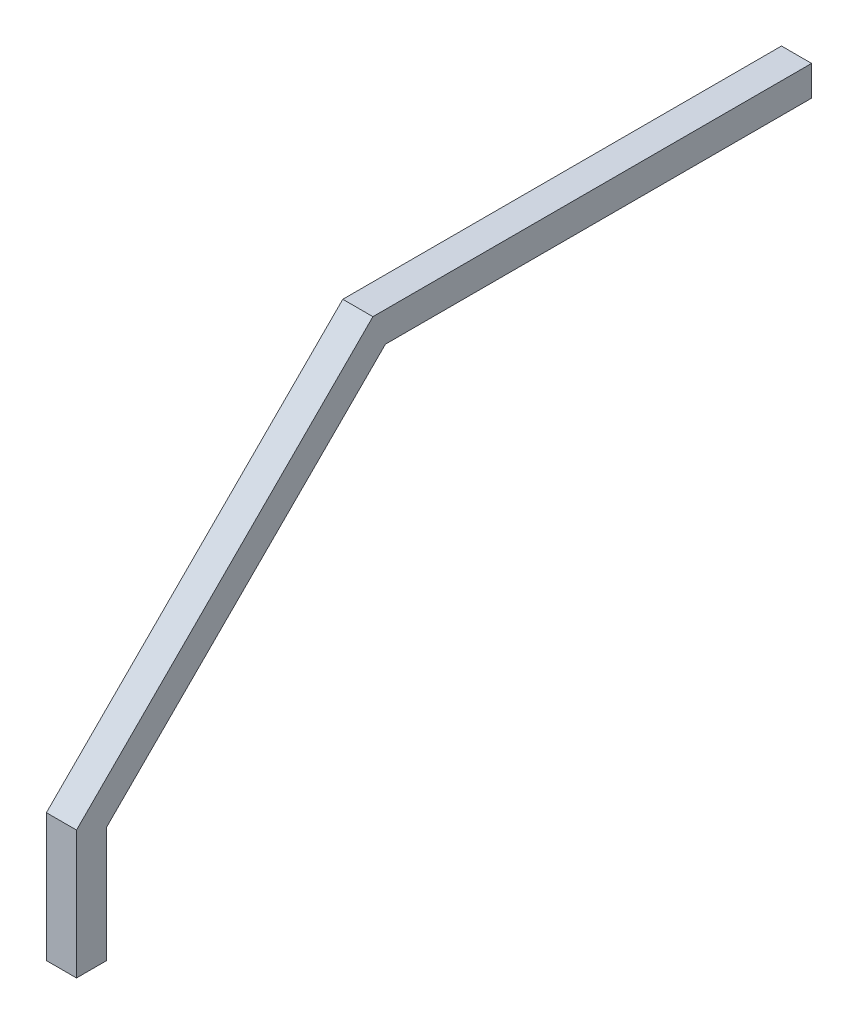
ISO-10303-21;
HEADER;
FILE_DESCRIPTION(('STEP AP214'),'2;1');
FILE_NAME('part.step','',(''),(''),'','','');
FILE_SCHEMA(('AUTOMOTIVE_DESIGN { 1 0 10303 214 1 1 1 1 }'));
ENDSEC;
DATA;
#1=APPLICATION_CONTEXT('core data for automotive mechanical design processes');
#2=APPLICATION_PROTOCOL_DEFINITION('international standard','automotive_design',2000,#1);
#3=PRODUCT_CONTEXT('',#1,'mechanical');
#4=PRODUCT('Part','Part','',(#3));
#5=PRODUCT_RELATED_PRODUCT_CATEGORY('part','',(#4));
#6=PRODUCT_DEFINITION_FORMATION('','',#4);
#7=PRODUCT_DEFINITION_CONTEXT('part definition',#1,'design');
#8=PRODUCT_DEFINITION('design','',#6,#7);
#9=PRODUCT_DEFINITION_SHAPE('','',#8);
#10=(LENGTH_UNIT() NAMED_UNIT(*) SI_UNIT(.MILLI.,.METRE.));
#11=(NAMED_UNIT(*) PLANE_ANGLE_UNIT() SI_UNIT($,.RADIAN.));
#12=(NAMED_UNIT(*) SI_UNIT($,.STERADIAN.) SOLID_ANGLE_UNIT());
#13=UNCERTAINTY_MEASURE_WITH_UNIT(LENGTH_MEASURE(1.E-05),#10,'distance_accuracy_value','');
#14=(GEOMETRIC_REPRESENTATION_CONTEXT(3) GLOBAL_UNCERTAINTY_ASSIGNED_CONTEXT((#13)) GLOBAL_UNIT_ASSIGNED_CONTEXT((#10,
#11,#12)) REPRESENTATION_CONTEXT('',''));
#15=CARTESIAN_POINT('',(0.,0.,0.));
#16=DIRECTION('',(0.,0.,1.));
#17=DIRECTION('',(1.,0.,0.));
#18=AXIS2_PLACEMENT_3D('',#15,#16,#17);
#19=CARTESIAN_POINT('',(25.4,450.,0.));
#20=DIRECTION('',(0.,0.,-1.));
#21=DIRECTION('',(-1.,0.,0.));
#22=AXIS2_PLACEMENT_3D('',#19,#20,#21);
#23=PLANE('',#22);
#24=DIRECTION('',(0.,-1.,0.));
#25=VECTOR('',#24,1.);
#26=CARTESIAN_POINT('',(0.,450.,0.));
#27=LINE('',#26,#25);
#28=CARTESIAN_POINT('',(0.,450.,0.));
#29=VERTEX_POINT('',#28);
#30=CARTESIAN_POINT('',(0.,341.93505652956,0.));
#31=VERTEX_POINT('',#30);
#32=EDGE_CURVE('E129',#29,#31,#27,.T.);
#33=ORIENTED_EDGE('',*,*,#32,.T.);
#34=DIRECTION('',(-1.,0.,0.));
#35=VECTOR('',#34,1.);
#36=CARTESIAN_POINT('',(25.4,341.93505652956,0.));
#37=LINE('',#36,#35);
#38=CARTESIAN_POINT('',(25.4,341.93505652956,0.));
#39=VERTEX_POINT('',#38);
#40=EDGE_CURVE('E11',#39,#31,#37,.T.);
#41=ORIENTED_EDGE('',*,*,#40,.F.);
#42=DIRECTION('',(0.,-1.,0.));
#43=VECTOR('',#42,1.);
#44=CARTESIAN_POINT('',(25.4,450.,0.));
#45=LINE('',#44,#43);
#46=CARTESIAN_POINT('',(25.4,450.,0.));
#47=VERTEX_POINT('',#46);
#48=EDGE_CURVE('E143',#47,#39,#45,.T.);
#49=ORIENTED_EDGE('',*,*,#48,.F.);
#50=DIRECTION('',(-1.,0.,0.));
#51=VECTOR('',#50,1.);
#52=CARTESIAN_POINT('',(25.4,450.,0.));
#53=LINE('',#52,#51);
#54=EDGE_CURVE('E125',#47,#29,#53,.T.);
#55=ORIENTED_EDGE('',*,*,#54,.T.);
#56=EDGE_LOOP('',(#33,#41,#49,#55));
#57=FACE_BOUND('',#56,.T.);
#58=ADVANCED_FACE('F33',(#57),#23,.F.);
#59=CARTESIAN_POINT('',(25.4,341.93505652956,0.));
#60=DIRECTION('',(0.,1.,0.));
#61=DIRECTION('',(0.,0.,1.));
#62=AXIS2_PLACEMENT_3D('',#59,#60,#61);
#63=PLANE('',#62);
#64=DIRECTION('',(0.,0.,-1.));
#65=VECTOR('',#64,1.);
#66=CARTESIAN_POINT('',(0.,341.93505652956,0.));
#67=LINE('',#66,#65);
#68=CARTESIAN_POINT('',(0.,341.93505652956,-25.4));
#69=VERTEX_POINT('',#68);
#70=EDGE_CURVE('E132',#31,#69,#67,.T.);
#71=ORIENTED_EDGE('',*,*,#70,.T.);
#72=DIRECTION('',(-1.,0.,0.));
#73=VECTOR('',#72,1.);
#74=CARTESIAN_POINT('',(25.4,341.93505652956,-25.4));
#75=LINE('',#74,#73);
#76=CARTESIAN_POINT('',(25.4,341.93505652956,-25.4));
#77=VERTEX_POINT('',#76);
#78=EDGE_CURVE('E41',#77,#69,#75,.T.);
#79=ORIENTED_EDGE('',*,*,#78,.F.);
#80=DIRECTION('',(0.,0.,-1.));
#81=VECTOR('',#80,1.);
#82=CARTESIAN_POINT('',(25.4,341.93505652956,0.));
#83=LINE('',#82,#81);
#84=EDGE_CURVE('E92',#39,#77,#83,.T.);
#85=ORIENTED_EDGE('',*,*,#84,.F.);
#86=ORIENTED_EDGE('',*,*,#40,.T.);
#87=EDGE_LOOP('',(#71,#79,#85,#86));
#88=FACE_BOUND('',#87,.T.);
#89=ADVANCED_FACE('F178',(#88),#63,.F.);
#90=CARTESIAN_POINT('',(25.4,439.478975515723,-25.4));
#91=DIRECTION('',(0.,0.,1.));
#92=DIRECTION('',(0.,-1.,0.));
#93=AXIS2_PLACEMENT_3D('',#90,#91,#92);
#94=PLANE('',#93);
#95=DIRECTION('',(0.,1.,0.));
#96=VECTOR('',#95,1.);
#97=CARTESIAN_POINT('',(0.,439.478975515723,-25.4));
#98=LINE('',#97,#96);
#99=CARTESIAN_POINT('',(0.,439.478975515723,-25.4));
#100=VERTEX_POINT('',#99);
#101=EDGE_CURVE('E134',#69,#100,#98,.T.);
#102=ORIENTED_EDGE('',*,*,#101,.T.);
#103=DIRECTION('',(-1.,0.,0.));
#104=VECTOR('',#103,1.);
#105=CARTESIAN_POINT('',(25.4,439.478975515723,-25.4));
#106=LINE('',#105,#104);
#107=CARTESIAN_POINT('',(25.4,439.478975515723,-25.4));
#108=VERTEX_POINT('',#107);
#109=EDGE_CURVE('E150',#108,#100,#106,.T.);
#110=ORIENTED_EDGE('',*,*,#109,.F.);
#111=DIRECTION('',(0.,1.,0.));
#112=VECTOR('',#111,1.);
#113=CARTESIAN_POINT('',(25.4,439.478975515723,-25.4));
#114=LINE('',#113,#112);
#115=EDGE_CURVE('E158',#77,#108,#114,.T.);
#116=ORIENTED_EDGE('',*,*,#115,.F.);
#117=ORIENTED_EDGE('',*,*,#78,.T.);
#118=EDGE_LOOP('',(#102,#110,#116,#117));
#119=FACE_BOUND('',#118,.T.);
#120=ADVANCED_FACE('F156',(#119),#94,.F.);
#121=CARTESIAN_POINT('',(25.4,439.478975515723,-25.4));
#122=DIRECTION('',(0.,0.707106781186544,0.707106781186551));
#123=DIRECTION('',(0.,-0.707106781186551,0.707106781186544));
#124=AXIS2_PLACEMENT_3D('',#121,#122,#123);
#125=PLANE('',#124);
#126=DIRECTION('',(0.,0.707106781186551,-0.707106781186544));
#127=VECTOR('',#126,1.);
#128=CARTESIAN_POINT('',(0.,439.478975515723,-25.4));
#129=LINE('',#128,#127);
#130=CARTESIAN_POINT('',(0.,674.6,-260.521024484274));
#131=VERTEX_POINT('',#130);
#132=EDGE_CURVE('E136',#100,#131,#129,.T.);
#133=ORIENTED_EDGE('',*,*,#132,.T.);
#134=DIRECTION('',(-1.,0.,0.));
#135=VECTOR('',#134,1.);
#136=CARTESIAN_POINT('',(25.4,674.6,-260.521024484274));
#137=LINE('',#136,#135);
#138=CARTESIAN_POINT('',(25.4,674.6,-260.521024484274));
#139=VERTEX_POINT('',#138);
#140=EDGE_CURVE('E147',#139,#131,#137,.T.);
#141=ORIENTED_EDGE('',*,*,#140,.F.);
#142=DIRECTION('',(0.,0.707106781186551,-0.707106781186544));
#143=VECTOR('',#142,1.);
#144=CARTESIAN_POINT('',(25.4,439.478975515723,-25.4));
#145=LINE('',#144,#143);
#146=EDGE_CURVE('E170',#108,#139,#145,.T.);
#147=ORIENTED_EDGE('',*,*,#146,.F.);
#148=ORIENTED_EDGE('',*,*,#109,.T.);
#149=EDGE_LOOP('',(#133,#141,#147,#148));
#150=FACE_BOUND('',#149,.T.);
#151=ADVANCED_FACE('F166',(#150),#125,.F.);
#152=CARTESIAN_POINT('',(25.4,674.6,-260.521024484274));
#153=DIRECTION('',(0.,1.,0.));
#154=DIRECTION('',(0.,0.,1.));
#155=AXIS2_PLACEMENT_3D('',#152,#153,#154);
#156=PLANE('',#155);
#157=DIRECTION('',(0.,0.,-1.));
#158=VECTOR('',#157,1.);
#159=CARTESIAN_POINT('',(0.,674.6,-260.521024484274));
#160=LINE('',#159,#158);
#161=CARTESIAN_POINT('',(0.,674.6,-620.));
#162=VERTEX_POINT('',#161);
#163=EDGE_CURVE('E138',#131,#162,#160,.T.);
#164=ORIENTED_EDGE('',*,*,#163,.T.);
#165=DIRECTION('',(-1.,0.,0.));
#166=VECTOR('',#165,1.);
#167=CARTESIAN_POINT('',(25.4,674.6,-620.));
#168=LINE('',#167,#166);
#169=CARTESIAN_POINT('',(25.4,674.6,-620.));
#170=VERTEX_POINT('',#169);
#171=EDGE_CURVE('E120',#170,#162,#168,.T.);
#172=ORIENTED_EDGE('',*,*,#171,.F.);
#173=DIRECTION('',(0.,0.,-1.));
#174=VECTOR('',#173,1.);
#175=CARTESIAN_POINT('',(25.4,674.6,-260.521024484274));
#176=LINE('',#175,#174);
#177=EDGE_CURVE('E111',#139,#170,#176,.T.);
#178=ORIENTED_EDGE('',*,*,#177,.F.);
#179=ORIENTED_EDGE('',*,*,#140,.T.);
#180=EDGE_LOOP('',(#164,#172,#178,#179));
#181=FACE_BOUND('',#180,.T.);
#182=ADVANCED_FACE('F169',(#181),#156,.F.);
#183=CARTESIAN_POINT('',(25.4,674.6,-620.));
#184=DIRECTION('',(0.,0.,1.));
#185=DIRECTION('',(1.,0.,0.));
#186=AXIS2_PLACEMENT_3D('',#183,#184,#185);
#187=PLANE('',#186);
#188=DIRECTION('',(0.,1.,0.));
#189=VECTOR('',#188,1.);
#190=CARTESIAN_POINT('',(0.,674.6,-620.));
#191=LINE('',#190,#189);
#192=CARTESIAN_POINT('',(0.,700.,-620.));
#193=VERTEX_POINT('',#192);
#194=EDGE_CURVE('E119',#162,#193,#191,.T.);
#195=ORIENTED_EDGE('',*,*,#194,.T.);
#196=DIRECTION('',(-1.,0.,0.));
#197=VECTOR('',#196,1.);
#198=CARTESIAN_POINT('',(25.4,700.,-620.));
#199=LINE('',#198,#197);
#200=CARTESIAN_POINT('',(25.4,700.,-620.));
#201=VERTEX_POINT('',#200);
#202=EDGE_CURVE('E116',#201,#193,#199,.T.);
#203=ORIENTED_EDGE('',*,*,#202,.F.);
#204=DIRECTION('',(0.,1.,0.));
#205=VECTOR('',#204,1.);
#206=CARTESIAN_POINT('',(25.4,674.6,-620.));
#207=LINE('',#206,#205);
#208=EDGE_CURVE('E105',#170,#201,#207,.T.);
#209=ORIENTED_EDGE('',*,*,#208,.F.);
#210=ORIENTED_EDGE('',*,*,#171,.T.);
#211=EDGE_LOOP('',(#195,#203,#209,#210));
#212=FACE_BOUND('',#211,.T.);
#213=ADVANCED_FACE('F117',(#212),#187,.F.);
#214=CARTESIAN_POINT('',(25.4,700.,-249.999999999997));
#215=DIRECTION('',(0.,-1.,0.));
#216=DIRECTION('',(0.,0.,-1.));
#217=AXIS2_PLACEMENT_3D('',#214,#215,#216);
#218=PLANE('',#217);
#219=DIRECTION('',(0.,0.,1.));
#220=VECTOR('',#219,1.);
#221=CARTESIAN_POINT('',(0.,700.,-249.999999999997));
#222=LINE('',#221,#220);
#223=CARTESIAN_POINT('',(0.,700.,-249.999999999997));
#224=VERTEX_POINT('',#223);
#225=EDGE_CURVE('E78',#193,#224,#222,.T.);
#226=ORIENTED_EDGE('',*,*,#225,.T.);
#227=DIRECTION('',(-1.,0.,0.));
#228=VECTOR('',#227,1.);
#229=CARTESIAN_POINT('',(25.4,700.,-249.999999999997));
#230=LINE('',#229,#228);
#231=CARTESIAN_POINT('',(25.4,700.,-249.999999999997));
#232=VERTEX_POINT('',#231);
#233=EDGE_CURVE('E121',#232,#224,#230,.T.);
#234=ORIENTED_EDGE('',*,*,#233,.F.);
#235=DIRECTION('',(0.,0.,1.));
#236=VECTOR('',#235,1.);
#237=CARTESIAN_POINT('',(25.4,700.,-249.999999999997));
#238=LINE('',#237,#236);
#239=EDGE_CURVE('E109',#201,#232,#238,.T.);
#240=ORIENTED_EDGE('',*,*,#239,.F.);
#241=ORIENTED_EDGE('',*,*,#202,.T.);
#242=EDGE_LOOP('',(#226,#234,#240,#241));
#243=FACE_BOUND('',#242,.T.);
#244=ADVANCED_FACE('F123',(#243),#218,.F.);
#245=CARTESIAN_POINT('',(25.4,450.,0.));
#246=DIRECTION('',(0.,-0.707106781186543,-0.707106781186551));
#247=DIRECTION('',(0.,0.707106781186551,-0.707106781186544));
#248=AXIS2_PLACEMENT_3D('',#245,#246,#247);
#249=PLANE('',#248);
#250=DIRECTION('',(0.,-0.707106781186551,0.707106781186544));
#251=VECTOR('',#250,1.);
#252=CARTESIAN_POINT('',(0.,450.,0.));
#253=LINE('',#252,#251);
#254=EDGE_CURVE('E84',#224,#29,#253,.T.);
#255=ORIENTED_EDGE('',*,*,#254,.T.);
#256=ORIENTED_EDGE('',*,*,#54,.F.);
#257=DIRECTION('',(0.,-0.707106781186551,0.707106781186544));
#258=VECTOR('',#257,1.);
#259=CARTESIAN_POINT('',(25.4,450.,0.));
#260=LINE('',#259,#258);
#261=EDGE_CURVE('E49',#232,#47,#260,.T.);
#262=ORIENTED_EDGE('',*,*,#261,.F.);
#263=ORIENTED_EDGE('',*,*,#233,.T.);
#264=EDGE_LOOP('',(#255,#256,#262,#263));
#265=FACE_BOUND('',#264,.T.);
#266=ADVANCED_FACE('F194',(#265),#249,.F.);
#267=CARTESIAN_POINT('',(25.4,0.,0.));
#268=DIRECTION('',(1.,0.,0.));
#269=DIRECTION('',(0.,0.,-1.));
#270=AXIS2_PLACEMENT_3D('',#267,#268,#269);
#271=PLANE('',#270);
#272=ORIENTED_EDGE('',*,*,#48,.T.);
#273=ORIENTED_EDGE('',*,*,#84,.T.);
#274=ORIENTED_EDGE('',*,*,#115,.T.);
#275=ORIENTED_EDGE('',*,*,#146,.T.);
#276=ORIENTED_EDGE('',*,*,#177,.T.);
#277=ORIENTED_EDGE('',*,*,#208,.T.);
#278=ORIENTED_EDGE('',*,*,#239,.T.);
#279=ORIENTED_EDGE('',*,*,#261,.T.);
#280=EDGE_LOOP('',(#272,#273,#274,#275,#276,#277,#278,#279));
#281=FACE_BOUND('',#280,.T.);
#282=ADVANCED_FACE('F107',(#281),#271,.T.);
#283=CARTESIAN_POINT('',(0.,0.,0.));
#284=DIRECTION('',(1.,0.,0.));
#285=DIRECTION('',(0.,0.,-1.));
#286=AXIS2_PLACEMENT_3D('',#283,#284,#285);
#287=PLANE('',#286);
#288=ORIENTED_EDGE('',*,*,#32,.F.);
#289=ORIENTED_EDGE('',*,*,#254,.F.);
#290=ORIENTED_EDGE('',*,*,#225,.F.);
#291=ORIENTED_EDGE('',*,*,#194,.F.);
#292=ORIENTED_EDGE('',*,*,#163,.F.);
#293=ORIENTED_EDGE('',*,*,#132,.F.);
#294=ORIENTED_EDGE('',*,*,#101,.F.);
#295=ORIENTED_EDGE('',*,*,#70,.F.);
#296=EDGE_LOOP('',(#288,#289,#290,#291,#292,#293,#294,#295));
#297=FACE_BOUND('',#296,.T.);
#298=ADVANCED_FACE('F162',(#297),#287,.F.);
#299=CLOSED_SHELL('',(#58,#89,#120,#151,#182,#213,#244,#266,#282,#298));
#300=MANIFOLD_SOLID_BREP('B2',#299);
#301=ADVANCED_BREP_SHAPE_REPRESENTATION('',(#18,#300),#14);
#302=SHAPE_DEFINITION_REPRESENTATION(#9,#301);
ENDSEC;
END-ISO-10303-21;
